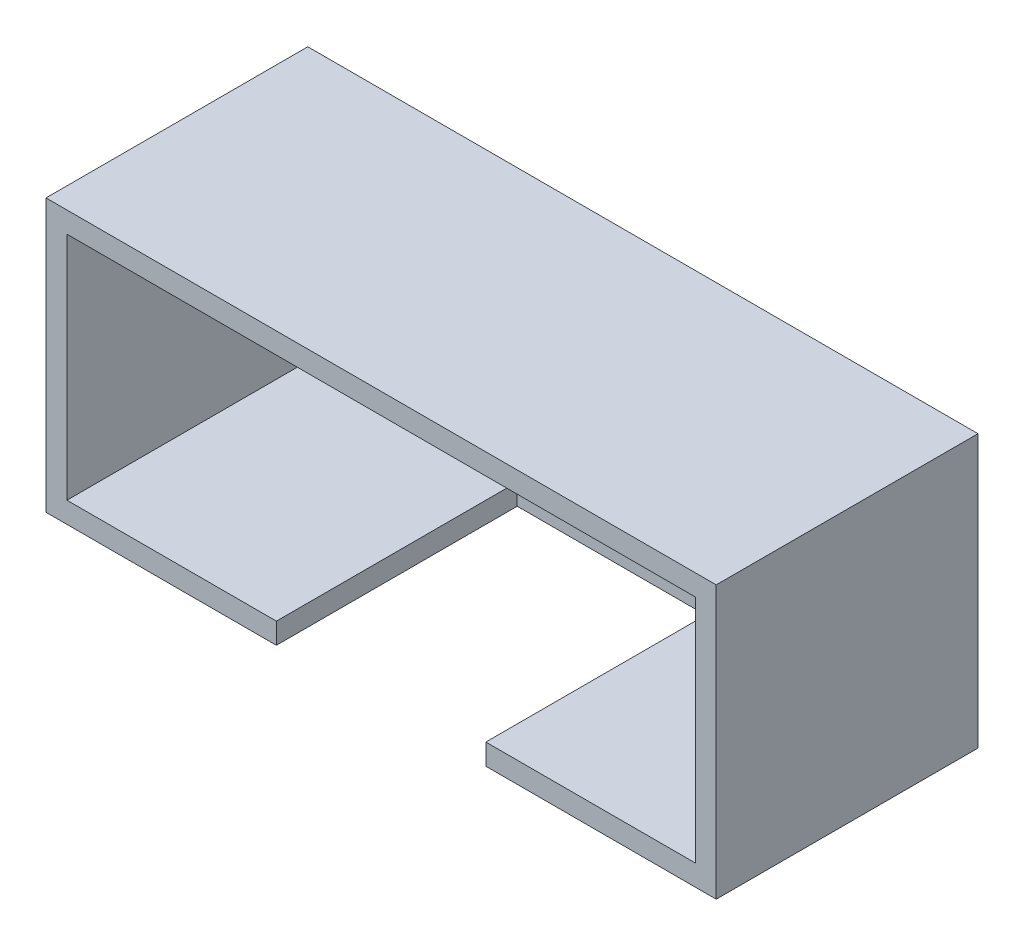
ISO-10303-21;
HEADER;
FILE_DESCRIPTION(('STEP AP214'),'2;1');
FILE_NAME('part.step','',(''),(''),'','','');
FILE_SCHEMA(('AUTOMOTIVE_DESIGN { 1 0 10303 214 1 1 1 1 }'));
ENDSEC;
DATA;
#1=APPLICATION_CONTEXT('core data for automotive mechanical design processes');
#2=APPLICATION_PROTOCOL_DEFINITION('international standard','automotive_design',2000,#1);
#3=PRODUCT_CONTEXT('',#1,'mechanical');
#4=PRODUCT('Part','Part','',(#3));
#5=PRODUCT_RELATED_PRODUCT_CATEGORY('part','',(#4));
#6=PRODUCT_DEFINITION_FORMATION('','',#4);
#7=PRODUCT_DEFINITION_CONTEXT('part definition',#1,'design');
#8=PRODUCT_DEFINITION('design','',#6,#7);
#9=PRODUCT_DEFINITION_SHAPE('','',#8);
#10=(LENGTH_UNIT() NAMED_UNIT(*) SI_UNIT(.MILLI.,.METRE.));
#11=(NAMED_UNIT(*) PLANE_ANGLE_UNIT() SI_UNIT($,.RADIAN.));
#12=(NAMED_UNIT(*) SI_UNIT($,.STERADIAN.) SOLID_ANGLE_UNIT());
#13=UNCERTAINTY_MEASURE_WITH_UNIT(LENGTH_MEASURE(1.E-05),#10,'distance_accuracy_value','');
#14=(GEOMETRIC_REPRESENTATION_CONTEXT(3) GLOBAL_UNCERTAINTY_ASSIGNED_CONTEXT((#13)) GLOBAL_UNIT_ASSIGNED_CONTEXT((#10,
#11,#12)) REPRESENTATION_CONTEXT('',''));
#15=CARTESIAN_POINT('',(0.,0.,0.));
#16=DIRECTION('',(0.,0.,1.));
#17=DIRECTION('',(1.,0.,0.));
#18=AXIS2_PLACEMENT_3D('',#15,#16,#17);
#19=CARTESIAN_POINT('',(-2.,-2.60000000000001,0.4));
#20=DIRECTION('',(-1.,0.,0.));
#21=DIRECTION('',(0.,-1.,0.));
#22=AXIS2_PLACEMENT_3D('',#19,#20,#21);
#23=PLANE('',#22);
#24=DIRECTION('',(0.,-1.,0.));
#25=VECTOR('',#24,1.);
#26=CARTESIAN_POINT('',(-2.,-2.60000000000001,5.));
#27=LINE('',#26,#25);
#28=CARTESIAN_POINT('',(-2.,-2.60000000000001,5.));
#29=VERTEX_POINT('',#28);
#30=CARTESIAN_POINT('',(-2.,-2.20000000000002,5.));
#31=VERTEX_POINT('',#30);
#32=EDGE_CURVE('E138',#29,#31,#27,.F.);
#33=ORIENTED_EDGE('',*,*,#32,.F.);
#34=DIRECTION('',(0.,0.,1.));
#35=VECTOR('',#34,1.);
#36=CARTESIAN_POINT('',(-2.,-2.60000000000001,0.));
#37=LINE('',#36,#35);
#38=CARTESIAN_POINT('',(-2.,-2.60000000000001,0.4));
#39=VERTEX_POINT('',#38);
#40=EDGE_CURVE('E114',#39,#29,#37,.T.);
#41=ORIENTED_EDGE('',*,*,#40,.F.);
#42=DIRECTION('',(0.,1.,0.));
#43=VECTOR('',#42,1.);
#44=CARTESIAN_POINT('',(-2.,0.,0.4));
#45=LINE('',#44,#43);
#46=CARTESIAN_POINT('',(-2.,-2.20000000000002,0.4));
#47=VERTEX_POINT('',#46);
#48=EDGE_CURVE('E109',#47,#39,#45,.F.);
#49=ORIENTED_EDGE('',*,*,#48,.F.);
#50=DIRECTION('',(0.,0.,1.));
#51=VECTOR('',#50,1.);
#52=CARTESIAN_POINT('',(-2.,-2.20000000000002,0.));
#53=LINE('',#52,#51);
#54=EDGE_CURVE('E111',#31,#47,#53,.F.);
#55=ORIENTED_EDGE('',*,*,#54,.F.);
#56=EDGE_LOOP('',(#33,#41,#49,#55));
#57=FACE_BOUND('',#56,.T.);
#58=ADVANCED_FACE('F17',(#57),#23,.F.);
#59=CARTESIAN_POINT('',(2.,-2.60000000000001,5.));
#60=DIRECTION('',(1.,0.,0.));
#61=DIRECTION('',(0.,1.,0.));
#62=AXIS2_PLACEMENT_3D('',#59,#60,#61);
#63=PLANE('',#62);
#64=DIRECTION('',(0.,1.,0.));
#65=VECTOR('',#64,1.);
#66=CARTESIAN_POINT('',(2.,0.,0.4));
#67=LINE('',#66,#65);
#68=CARTESIAN_POINT('',(2.,-2.60000000000001,0.4));
#69=VERTEX_POINT('',#68);
#70=CARTESIAN_POINT('',(2.,-2.20000000000002,0.4));
#71=VERTEX_POINT('',#70);
#72=EDGE_CURVE('E117',#69,#71,#67,.T.);
#73=ORIENTED_EDGE('',*,*,#72,.F.);
#74=DIRECTION('',(0.,0.,1.));
#75=VECTOR('',#74,1.);
#76=CARTESIAN_POINT('',(2.,-2.60000000000001,0.));
#77=LINE('',#76,#75);
#78=CARTESIAN_POINT('',(2.,-2.60000000000001,5.));
#79=VERTEX_POINT('',#78);
#80=EDGE_CURVE('E265',#79,#69,#77,.F.);
#81=ORIENTED_EDGE('',*,*,#80,.F.);
#82=DIRECTION('',(0.,1.,0.));
#83=VECTOR('',#82,1.);
#84=CARTESIAN_POINT('',(2.,-2.60000000000001,5.));
#85=LINE('',#84,#83);
#86=CARTESIAN_POINT('',(2.,-2.20000000000002,5.));
#87=VERTEX_POINT('',#86);
#88=EDGE_CURVE('E118',#87,#79,#85,.F.);
#89=ORIENTED_EDGE('',*,*,#88,.F.);
#90=DIRECTION('',(0.,0.,1.));
#91=VECTOR('',#90,1.);
#92=CARTESIAN_POINT('',(2.,-2.20000000000002,0.));
#93=LINE('',#92,#91);
#94=EDGE_CURVE('E275',#71,#87,#93,.T.);
#95=ORIENTED_EDGE('',*,*,#94,.F.);
#96=EDGE_LOOP('',(#73,#81,#89,#95));
#97=FACE_BOUND('',#96,.T.);
#98=ADVANCED_FACE('F310',(#97),#63,.F.);
#99=CARTESIAN_POINT('',(0.,0.,0.4));
#100=DIRECTION('',(0.,0.,1.));
#101=DIRECTION('',(1.,0.,0.));
#102=AXIS2_PLACEMENT_3D('',#99,#100,#101);
#103=PLANE('',#102);
#104=CARTESIAN_POINT('',(-2.53,0.749999999999982,0.4));
#105=DIRECTION('',(0.,0.,1.));
#106=DIRECTION('',(1.,0.,0.));
#107=AXIS2_PLACEMENT_3D('',#104,#105,#106);
#108=CIRCLE('',#107,0.399999999999991);
#109=CARTESIAN_POINT('',(-2.13000000000001,0.749999999999982,0.4));
#110=VERTEX_POINT('',#109);
#111=EDGE_CURVE('E191',#110,#110,#108,.F.);
#112=ORIENTED_EDGE('',*,*,#111,.T.);
#113=EDGE_LOOP('',(#112));
#114=FACE_BOUND('',#113,.T.);
#115=CARTESIAN_POINT('',(-2.53,-0.520000000000007,0.4));
#116=DIRECTION('',(0.,0.,1.));
#117=DIRECTION('',(1.,0.,0.));
#118=AXIS2_PLACEMENT_3D('',#115,#116,#117);
#119=CIRCLE('',#118,0.399999999999991);
#120=CARTESIAN_POINT('',(-2.13000000000001,-0.520000000000007,0.4));
#121=VERTEX_POINT('',#120);
#122=EDGE_CURVE('E189',#121,#121,#119,.F.);
#123=ORIENTED_EDGE('',*,*,#122,.T.);
#124=EDGE_LOOP('',(#123));
#125=FACE_BOUND('',#124,.T.);
#126=CARTESIAN_POINT('',(2.55,0.749999999999981,0.4));
#127=DIRECTION('',(0.,0.,1.));
#128=DIRECTION('',(1.,0.,0.));
#129=AXIS2_PLACEMENT_3D('',#126,#127,#128);
#130=CIRCLE('',#129,0.399999999999991);
#131=CARTESIAN_POINT('',(2.94999999999999,0.749999999999981,0.4));
#132=VERTEX_POINT('',#131);
#133=EDGE_CURVE('E177',#132,#132,#130,.F.);
#134=ORIENTED_EDGE('',*,*,#133,.T.);
#135=EDGE_LOOP('',(#134));
#136=FACE_BOUND('',#135,.T.);
#137=CARTESIAN_POINT('',(2.55,-0.520000000000008,0.4));
#138=DIRECTION('',(0.,0.,1.));
#139=DIRECTION('',(1.,0.,0.));
#140=AXIS2_PLACEMENT_3D('',#137,#138,#139);
#141=CIRCLE('',#140,0.399999999999991);
#142=CARTESIAN_POINT('',(2.94999999999999,-0.520000000000008,0.4));
#143=VERTEX_POINT('',#142);
#144=EDGE_CURVE('E128',#143,#143,#141,.F.);
#145=ORIENTED_EDGE('',*,*,#144,.T.);
#146=EDGE_LOOP('',(#145));
#147=FACE_BOUND('',#146,.T.);
#148=CARTESIAN_POINT('',(1.28,-0.520000000000007,0.4));
#149=DIRECTION('',(0.,0.,1.));
#150=DIRECTION('',(1.,0.,0.));
#151=AXIS2_PLACEMENT_3D('',#148,#149,#150);
#152=CIRCLE('',#151,0.399999999999991);
#153=CARTESIAN_POINT('',(1.67999999999999,-0.520000000000007,0.4));
#154=VERTEX_POINT('',#153);
#155=EDGE_CURVE('E20',#154,#154,#152,.F.);
#156=ORIENTED_EDGE('',*,*,#155,.T.);
#157=EDGE_LOOP('',(#156));
#158=FACE_BOUND('',#157,.T.);
#159=CARTESIAN_POINT('',(-1.26,0.749999999999982,0.4));
#160=DIRECTION('',(0.,0.,1.));
#161=DIRECTION('',(1.,0.,0.));
#162=AXIS2_PLACEMENT_3D('',#159,#160,#161);
#163=CIRCLE('',#162,0.399999999999991);
#164=CARTESIAN_POINT('',(-0.860000000000009,0.749999999999982,0.4));
#165=VERTEX_POINT('',#164);
#166=EDGE_CURVE('E186',#165,#165,#163,.F.);
#167=ORIENTED_EDGE('',*,*,#166,.T.);
#168=EDGE_LOOP('',(#167));
#169=FACE_BOUND('',#168,.T.);
#170=CARTESIAN_POINT('',(-1.26,-0.520000000000007,0.4));
#171=DIRECTION('',(0.,0.,1.));
#172=DIRECTION('',(1.,0.,0.));
#173=AXIS2_PLACEMENT_3D('',#170,#171,#172);
#174=CIRCLE('',#173,0.399999999999991);
#175=CARTESIAN_POINT('',(-0.860000000000009,-0.520000000000007,0.4));
#176=VERTEX_POINT('',#175);
#177=EDGE_CURVE('E183',#176,#176,#174,.F.);
#178=ORIENTED_EDGE('',*,*,#177,.T.);
#179=EDGE_LOOP('',(#178));
#180=FACE_BOUND('',#179,.T.);
#181=CARTESIAN_POINT('',(0.0100000000000004,-0.520000000000007,0.4));
#182=DIRECTION('',(0.,0.,1.));
#183=DIRECTION('',(1.,0.,0.));
#184=AXIS2_PLACEMENT_3D('',#181,#182,#183);
#185=CIRCLE('',#184,0.399999999999991);
#186=CARTESIAN_POINT('',(0.409999999999991,-0.520000000000007,0.4));
#187=VERTEX_POINT('',#186);
#188=EDGE_CURVE('E180',#187,#187,#185,.F.);
#189=ORIENTED_EDGE('',*,*,#188,.T.);
#190=EDGE_LOOP('',(#189));
#191=FACE_BOUND('',#190,.T.);
#192=CARTESIAN_POINT('',(1.28,0.749999999999982,0.4));
#193=DIRECTION('',(0.,0.,1.));
#194=DIRECTION('',(1.,0.,0.));
#195=AXIS2_PLACEMENT_3D('',#192,#193,#194);
#196=CIRCLE('',#195,0.399999999999991);
#197=CARTESIAN_POINT('',(1.67999999999999,0.749999999999982,0.4));
#198=VERTEX_POINT('',#197);
#199=EDGE_CURVE('E174',#198,#198,#196,.F.);
#200=ORIENTED_EDGE('',*,*,#199,.T.);
#201=EDGE_LOOP('',(#200));
#202=FACE_BOUND('',#201,.T.);
#203=CARTESIAN_POINT('',(0.0100000000000007,0.749999999999982,0.4));
#204=DIRECTION('',(0.,0.,1.));
#205=DIRECTION('',(1.,0.,0.));
#206=AXIS2_PLACEMENT_3D('',#203,#204,#205);
#207=CIRCLE('',#206,0.399999999999991);
#208=CARTESIAN_POINT('',(0.409999999999992,0.749999999999982,0.4));
#209=VERTEX_POINT('',#208);
#210=EDGE_CURVE('E131',#209,#209,#207,.F.);
#211=ORIENTED_EDGE('',*,*,#210,.T.);
#212=EDGE_LOOP('',(#211));
#213=FACE_BOUND('',#212,.T.);
#214=DIRECTION('',(1.,0.,0.));
#215=VECTOR('',#214,1.);
#216=CARTESIAN_POINT('',(-6.4,-2.60000000000001,0.4));
#217=LINE('',#216,#215);
#218=EDGE_CURVE('E263',#69,#39,#217,.F.);
#219=ORIENTED_EDGE('',*,*,#218,.F.);
#220=ORIENTED_EDGE('',*,*,#72,.T.);
#221=DIRECTION('',(-1.,0.,0.));
#222=VECTOR('',#221,1.);
#223=CARTESIAN_POINT('',(6.,-2.20000000000002,0.4));
#224=LINE('',#223,#222);
#225=CARTESIAN_POINT('',(6.,-2.20000000000002,0.4));
#226=VERTEX_POINT('',#225);
#227=EDGE_CURVE('E269',#226,#71,#224,.T.);
#228=ORIENTED_EDGE('',*,*,#227,.F.);
#229=DIRECTION('',(0.,-1.,0.));
#230=VECTOR('',#229,1.);
#231=CARTESIAN_POINT('',(6.,2.19999999999999,0.4));
#232=LINE('',#231,#230);
#233=CARTESIAN_POINT('',(6.,2.19999999999999,0.4));
#234=VERTEX_POINT('',#233);
#235=EDGE_CURVE('E281',#234,#226,#232,.T.);
#236=ORIENTED_EDGE('',*,*,#235,.F.);
#237=DIRECTION('',(1.,0.,0.));
#238=VECTOR('',#237,1.);
#239=CARTESIAN_POINT('',(-6.,2.2,0.4));
#240=LINE('',#239,#238);
#241=CARTESIAN_POINT('',(-6.,2.2,0.4));
#242=VERTEX_POINT('',#241);
#243=EDGE_CURVE('E286',#242,#234,#240,.T.);
#244=ORIENTED_EDGE('',*,*,#243,.F.);
#245=DIRECTION('',(0.,1.,0.));
#246=VECTOR('',#245,1.);
#247=CARTESIAN_POINT('',(-6.,-2.20000000000002,0.4));
#248=LINE('',#247,#246);
#249=CARTESIAN_POINT('',(-6.,-2.20000000000002,0.4));
#250=VERTEX_POINT('',#249);
#251=EDGE_CURVE('E103',#250,#242,#248,.T.);
#252=ORIENTED_EDGE('',*,*,#251,.F.);
#253=DIRECTION('',(-1.,0.,0.));
#254=VECTOR('',#253,1.);
#255=CARTESIAN_POINT('',(6.,-2.20000000000002,0.4));
#256=LINE('',#255,#254);
#257=EDGE_CURVE('E120',#47,#250,#256,.T.);
#258=ORIENTED_EDGE('',*,*,#257,.F.);
#259=ORIENTED_EDGE('',*,*,#48,.T.);
#260=EDGE_LOOP('',(#219,#220,#228,#236,#244,#252,#258,#259));
#261=FACE_BOUND('',#260,.T.);
#262=ADVANCED_FACE('F121',(#114,#125,#136,#147,#158,#169,#180,#191,#202,#213,#261),#103,.T.);
#263=CARTESIAN_POINT('',(1.28,-0.520000000000007,0.));
#264=DIRECTION('',(0.,0.,1.));
#265=DIRECTION('',(1.,0.,0.));
#266=AXIS2_PLACEMENT_3D('',#263,#264,#265);
#267=CYLINDRICAL_SURFACE('',#266,0.399999999999991);
#268=ORIENTED_EDGE('',*,*,#155,.F.);
#269=EDGE_LOOP('',(#268));
#270=FACE_BOUND('',#269,.T.);
#271=CARTESIAN_POINT('',(1.28,-0.520000000000007,0.));
#272=DIRECTION('',(0.,0.,1.));
#273=DIRECTION('',(1.,0.,0.));
#274=AXIS2_PLACEMENT_3D('',#271,#272,#273);
#275=CIRCLE('',#274,0.399999999999991);
#276=CARTESIAN_POINT('',(1.67999999999999,-0.520000000000007,0.));
#277=VERTEX_POINT('',#276);
#278=EDGE_CURVE('E168',#277,#277,#275,.F.);
#279=ORIENTED_EDGE('',*,*,#278,.T.);
#280=EDGE_LOOP('',(#279));
#281=FACE_BOUND('',#280,.T.);
#282=ADVANCED_FACE('F200',(#270,#281),#267,.F.);
#283=CARTESIAN_POINT('',(-2.53,0.749999999999982,0.));
#284=DIRECTION('',(0.,0.,1.));
#285=DIRECTION('',(1.,0.,0.));
#286=AXIS2_PLACEMENT_3D('',#283,#284,#285);
#287=CYLINDRICAL_SURFACE('',#286,0.399999999999991);
#288=ORIENTED_EDGE('',*,*,#111,.F.);
#289=EDGE_LOOP('',(#288));
#290=FACE_BOUND('',#289,.T.);
#291=CARTESIAN_POINT('',(-2.53,0.749999999999982,0.));
#292=DIRECTION('',(0.,0.,1.));
#293=DIRECTION('',(1.,0.,0.));
#294=AXIS2_PLACEMENT_3D('',#291,#292,#293);
#295=CIRCLE('',#294,0.399999999999991);
#296=CARTESIAN_POINT('',(-2.13000000000001,0.749999999999982,0.));
#297=VERTEX_POINT('',#296);
#298=EDGE_CURVE('E165',#297,#297,#295,.F.);
#299=ORIENTED_EDGE('',*,*,#298,.T.);
#300=EDGE_LOOP('',(#299));
#301=FACE_BOUND('',#300,.T.);
#302=ADVANCED_FACE('F203',(#290,#301),#287,.F.);
#303=CARTESIAN_POINT('',(-2.53,-0.520000000000007,0.));
#304=DIRECTION('',(0.,0.,1.));
#305=DIRECTION('',(1.,0.,0.));
#306=AXIS2_PLACEMENT_3D('',#303,#304,#305);
#307=CYLINDRICAL_SURFACE('',#306,0.399999999999991);
#308=ORIENTED_EDGE('',*,*,#122,.F.);
#309=EDGE_LOOP('',(#308));
#310=FACE_BOUND('',#309,.T.);
#311=CARTESIAN_POINT('',(-2.53,-0.520000000000007,0.));
#312=DIRECTION('',(0.,0.,1.));
#313=DIRECTION('',(1.,0.,0.));
#314=AXIS2_PLACEMENT_3D('',#311,#312,#313);
#315=CIRCLE('',#314,0.399999999999991);
#316=CARTESIAN_POINT('',(-2.13000000000001,-0.520000000000007,0.));
#317=VERTEX_POINT('',#316);
#318=EDGE_CURVE('E162',#317,#317,#315,.F.);
#319=ORIENTED_EDGE('',*,*,#318,.T.);
#320=EDGE_LOOP('',(#319));
#321=FACE_BOUND('',#320,.T.);
#322=ADVANCED_FACE('F464',(#310,#321),#307,.F.);
#323=CARTESIAN_POINT('',(-1.26,0.749999999999982,0.));
#324=DIRECTION('',(0.,0.,1.));
#325=DIRECTION('',(1.,0.,0.));
#326=AXIS2_PLACEMENT_3D('',#323,#324,#325);
#327=CYLINDRICAL_SURFACE('',#326,0.399999999999991);
#328=ORIENTED_EDGE('',*,*,#166,.F.);
#329=EDGE_LOOP('',(#328));
#330=FACE_BOUND('',#329,.T.);
#331=CARTESIAN_POINT('',(-1.26,0.749999999999982,0.));
#332=DIRECTION('',(0.,0.,1.));
#333=DIRECTION('',(1.,0.,0.));
#334=AXIS2_PLACEMENT_3D('',#331,#332,#333);
#335=CIRCLE('',#334,0.399999999999991);
#336=CARTESIAN_POINT('',(-0.860000000000009,0.749999999999982,0.));
#337=VERTEX_POINT('',#336);
#338=EDGE_CURVE('E159',#337,#337,#335,.F.);
#339=ORIENTED_EDGE('',*,*,#338,.T.);
#340=EDGE_LOOP('',(#339));
#341=FACE_BOUND('',#340,.T.);
#342=ADVANCED_FACE('F454',(#330,#341),#327,.F.);
#343=CARTESIAN_POINT('',(-1.26,-0.520000000000007,0.));
#344=DIRECTION('',(0.,0.,1.));
#345=DIRECTION('',(1.,0.,0.));
#346=AXIS2_PLACEMENT_3D('',#343,#344,#345);
#347=CYLINDRICAL_SURFACE('',#346,0.399999999999991);
#348=ORIENTED_EDGE('',*,*,#177,.F.);
#349=EDGE_LOOP('',(#348));
#350=FACE_BOUND('',#349,.T.);
#351=CARTESIAN_POINT('',(-1.26,-0.520000000000007,0.));
#352=DIRECTION('',(0.,0.,1.));
#353=DIRECTION('',(1.,0.,0.));
#354=AXIS2_PLACEMENT_3D('',#351,#352,#353);
#355=CIRCLE('',#354,0.399999999999991);
#356=CARTESIAN_POINT('',(-0.860000000000009,-0.520000000000007,0.));
#357=VERTEX_POINT('',#356);
#358=EDGE_CURVE('E156',#357,#357,#355,.F.);
#359=ORIENTED_EDGE('',*,*,#358,.T.);
#360=EDGE_LOOP('',(#359));
#361=FACE_BOUND('',#360,.T.);
#362=ADVANCED_FACE('F444',(#350,#361),#347,.F.);
#363=CARTESIAN_POINT('',(0.0100000000000004,-0.520000000000007,0.));
#364=DIRECTION('',(0.,0.,1.));
#365=DIRECTION('',(1.,0.,0.));
#366=AXIS2_PLACEMENT_3D('',#363,#364,#365);
#367=CYLINDRICAL_SURFACE('',#366,0.399999999999991);
#368=ORIENTED_EDGE('',*,*,#188,.F.);
#369=EDGE_LOOP('',(#368));
#370=FACE_BOUND('',#369,.T.);
#371=CARTESIAN_POINT('',(0.0100000000000004,-0.520000000000007,0.));
#372=DIRECTION('',(0.,0.,1.));
#373=DIRECTION('',(1.,0.,0.));
#374=AXIS2_PLACEMENT_3D('',#371,#372,#373);
#375=CIRCLE('',#374,0.399999999999991);
#376=CARTESIAN_POINT('',(0.409999999999991,-0.520000000000007,0.));
#377=VERTEX_POINT('',#376);
#378=EDGE_CURVE('E153',#377,#377,#375,.F.);
#379=ORIENTED_EDGE('',*,*,#378,.T.);
#380=EDGE_LOOP('',(#379));
#381=FACE_BOUND('',#380,.T.);
#382=ADVANCED_FACE('F434',(#370,#381),#367,.F.);
#383=CARTESIAN_POINT('',(2.55,0.749999999999981,0.));
#384=DIRECTION('',(0.,0.,1.));
#385=DIRECTION('',(1.,0.,0.));
#386=AXIS2_PLACEMENT_3D('',#383,#384,#385);
#387=CYLINDRICAL_SURFACE('',#386,0.399999999999991);
#388=ORIENTED_EDGE('',*,*,#133,.F.);
#389=EDGE_LOOP('',(#388));
#390=FACE_BOUND('',#389,.T.);
#391=CARTESIAN_POINT('',(2.55,0.749999999999981,0.));
#392=DIRECTION('',(0.,0.,1.));
#393=DIRECTION('',(1.,0.,0.));
#394=AXIS2_PLACEMENT_3D('',#391,#392,#393);
#395=CIRCLE('',#394,0.399999999999991);
#396=CARTESIAN_POINT('',(2.94999999999999,0.749999999999981,0.));
#397=VERTEX_POINT('',#396);
#398=EDGE_CURVE('E150',#397,#397,#395,.F.);
#399=ORIENTED_EDGE('',*,*,#398,.T.);
#400=EDGE_LOOP('',(#399));
#401=FACE_BOUND('',#400,.T.);
#402=ADVANCED_FACE('F424',(#390,#401),#387,.F.);
#403=CARTESIAN_POINT('',(1.28,0.749999999999982,0.));
#404=DIRECTION('',(0.,0.,1.));
#405=DIRECTION('',(1.,0.,0.));
#406=AXIS2_PLACEMENT_3D('',#403,#404,#405);
#407=CYLINDRICAL_SURFACE('',#406,0.399999999999991);
#408=ORIENTED_EDGE('',*,*,#199,.F.);
#409=EDGE_LOOP('',(#408));
#410=FACE_BOUND('',#409,.T.);
#411=CARTESIAN_POINT('',(1.28,0.749999999999982,0.));
#412=DIRECTION('',(0.,0.,1.));
#413=DIRECTION('',(1.,0.,0.));
#414=AXIS2_PLACEMENT_3D('',#411,#412,#413);
#415=CIRCLE('',#414,0.399999999999991);
#416=CARTESIAN_POINT('',(1.67999999999999,0.749999999999982,0.));
#417=VERTEX_POINT('',#416);
#418=EDGE_CURVE('E147',#417,#417,#415,.F.);
#419=ORIENTED_EDGE('',*,*,#418,.T.);
#420=EDGE_LOOP('',(#419));
#421=FACE_BOUND('',#420,.T.);
#422=ADVANCED_FACE('F414',(#410,#421),#407,.F.);
#423=CARTESIAN_POINT('',(0.0100000000000007,0.749999999999982,0.));
#424=DIRECTION('',(0.,0.,1.));
#425=DIRECTION('',(1.,0.,0.));
#426=AXIS2_PLACEMENT_3D('',#423,#424,#425);
#427=CYLINDRICAL_SURFACE('',#426,0.399999999999991);
#428=ORIENTED_EDGE('',*,*,#210,.F.);
#429=EDGE_LOOP('',(#428));
#430=FACE_BOUND('',#429,.T.);
#431=CARTESIAN_POINT('',(0.0100000000000007,0.749999999999982,0.));
#432=DIRECTION('',(0.,0.,1.));
#433=DIRECTION('',(1.,0.,0.));
#434=AXIS2_PLACEMENT_3D('',#431,#432,#433);
#435=CIRCLE('',#434,0.399999999999991);
#436=CARTESIAN_POINT('',(0.409999999999992,0.749999999999982,0.));
#437=VERTEX_POINT('',#436);
#438=EDGE_CURVE('E144',#437,#437,#435,.F.);
#439=ORIENTED_EDGE('',*,*,#438,.T.);
#440=EDGE_LOOP('',(#439));
#441=FACE_BOUND('',#440,.T.);
#442=ADVANCED_FACE('F404',(#430,#441),#427,.F.);
#443=CARTESIAN_POINT('',(2.55,-0.520000000000008,0.));
#444=DIRECTION('',(0.,0.,1.));
#445=DIRECTION('',(1.,0.,0.));
#446=AXIS2_PLACEMENT_3D('',#443,#444,#445);
#447=CYLINDRICAL_SURFACE('',#446,0.399999999999991);
#448=ORIENTED_EDGE('',*,*,#144,.F.);
#449=EDGE_LOOP('',(#448));
#450=FACE_BOUND('',#449,.T.);
#451=CARTESIAN_POINT('',(2.55,-0.520000000000008,0.));
#452=DIRECTION('',(0.,0.,1.));
#453=DIRECTION('',(1.,0.,0.));
#454=AXIS2_PLACEMENT_3D('',#451,#452,#453);
#455=CIRCLE('',#454,0.399999999999991);
#456=CARTESIAN_POINT('',(2.94999999999999,-0.520000000000008,0.));
#457=VERTEX_POINT('',#456);
#458=EDGE_CURVE('E140',#457,#457,#455,.F.);
#459=ORIENTED_EDGE('',*,*,#458,.T.);
#460=EDGE_LOOP('',(#459));
#461=FACE_BOUND('',#460,.T.);
#462=ADVANCED_FACE('F395',(#450,#461),#447,.F.);
#463=CARTESIAN_POINT('',(6.,-2.20000000000002,0.));
#464=DIRECTION('',(0.,1.,0.));
#465=DIRECTION('',(-1.,0.,0.));
#466=AXIS2_PLACEMENT_3D('',#463,#464,#465);
#467=PLANE('',#466);
#468=DIRECTION('',(0.,0.,1.));
#469=VECTOR('',#468,1.);
#470=CARTESIAN_POINT('',(-6.,-2.20000000000002,0.));
#471=LINE('',#470,#469);
#472=CARTESIAN_POINT('',(-6.,-2.20000000000002,5.));
#473=VERTEX_POINT('',#472);
#474=EDGE_CURVE('E289',#473,#250,#471,.F.);
#475=ORIENTED_EDGE('',*,*,#474,.F.);
#476=DIRECTION('',(1.,0.,0.));
#477=VECTOR('',#476,1.);
#478=CARTESIAN_POINT('',(0.,-2.20000000000002,5.));
#479=LINE('',#478,#477);
#480=EDGE_CURVE('E127',#31,#473,#479,.F.);
#481=ORIENTED_EDGE('',*,*,#480,.F.);
#482=ORIENTED_EDGE('',*,*,#54,.T.);
#483=ORIENTED_EDGE('',*,*,#257,.T.);
#484=EDGE_LOOP('',(#475,#481,#482,#483));
#485=FACE_BOUND('',#484,.T.);
#486=ADVANCED_FACE('F125',(#485),#467,.T.);
#487=CARTESIAN_POINT('',(-6.,-2.20000000000002,0.));
#488=DIRECTION('',(1.,0.,0.));
#489=DIRECTION('',(0.,1.,0.));
#490=AXIS2_PLACEMENT_3D('',#487,#488,#489);
#491=PLANE('',#490);
#492=DIRECTION('',(0.,1.,0.));
#493=VECTOR('',#492,1.);
#494=CARTESIAN_POINT('',(-6.,0.,5.));
#495=LINE('',#494,#493);
#496=CARTESIAN_POINT('',(-6.,2.2,5.));
#497=VERTEX_POINT('',#496);
#498=EDGE_CURVE('E255',#473,#497,#495,.T.);
#499=ORIENTED_EDGE('',*,*,#498,.F.);
#500=ORIENTED_EDGE('',*,*,#474,.T.);
#501=ORIENTED_EDGE('',*,*,#251,.T.);
#502=DIRECTION('',(0.,0.,1.));
#503=VECTOR('',#502,1.);
#504=CARTESIAN_POINT('',(-6.,2.2,0.));
#505=LINE('',#504,#503);
#506=EDGE_CURVE('E283',#497,#242,#505,.F.);
#507=ORIENTED_EDGE('',*,*,#506,.F.);
#508=EDGE_LOOP('',(#499,#500,#501,#507));
#509=FACE_BOUND('',#508,.T.);
#510=ADVANCED_FACE('F292',(#509),#491,.T.);
#511=CARTESIAN_POINT('',(-6.,2.2,0.));
#512=DIRECTION('',(0.,-1.,0.));
#513=DIRECTION('',(1.,0.,0.));
#514=AXIS2_PLACEMENT_3D('',#511,#512,#513);
#515=PLANE('',#514);
#516=DIRECTION('',(1.,0.,0.));
#517=VECTOR('',#516,1.);
#518=CARTESIAN_POINT('',(0.,2.2,5.));
#519=LINE('',#518,#517);
#520=CARTESIAN_POINT('',(6.,2.2,5.));
#521=VERTEX_POINT('',#520);
#522=EDGE_CURVE('E252',#497,#521,#519,.T.);
#523=ORIENTED_EDGE('',*,*,#522,.F.);
#524=ORIENTED_EDGE('',*,*,#506,.T.);
#525=ORIENTED_EDGE('',*,*,#243,.T.);
#526=DIRECTION('',(0.,0.,1.));
#527=VECTOR('',#526,1.);
#528=CARTESIAN_POINT('',(6.,2.19999999999999,0.));
#529=LINE('',#528,#527);
#530=EDGE_CURVE('E278',#521,#234,#529,.F.);
#531=ORIENTED_EDGE('',*,*,#530,.F.);
#532=EDGE_LOOP('',(#523,#524,#525,#531));
#533=FACE_BOUND('',#532,.T.);
#534=ADVANCED_FACE('F295',(#533),#515,.T.);
#535=CARTESIAN_POINT('',(6.,2.19999999999999,0.));
#536=DIRECTION('',(-1.,0.,0.));
#537=DIRECTION('',(0.,-1.,0.));
#538=AXIS2_PLACEMENT_3D('',#535,#536,#537);
#539=PLANE('',#538);
#540=DIRECTION('',(0.,1.,0.));
#541=VECTOR('',#540,1.);
#542=CARTESIAN_POINT('',(6.,0.,5.));
#543=LINE('',#542,#541);
#544=CARTESIAN_POINT('',(6.,-2.20000000000002,5.));
#545=VERTEX_POINT('',#544);
#546=EDGE_CURVE('E249',#521,#545,#543,.F.);
#547=ORIENTED_EDGE('',*,*,#546,.F.);
#548=ORIENTED_EDGE('',*,*,#530,.T.);
#549=ORIENTED_EDGE('',*,*,#235,.T.);
#550=DIRECTION('',(0.,0.,1.));
#551=VECTOR('',#550,1.);
#552=CARTESIAN_POINT('',(6.,-2.20000000000002,0.));
#553=LINE('',#552,#551);
#554=EDGE_CURVE('E272',#545,#226,#553,.F.);
#555=ORIENTED_EDGE('',*,*,#554,.F.);
#556=EDGE_LOOP('',(#547,#548,#549,#555));
#557=FACE_BOUND('',#556,.T.);
#558=ADVANCED_FACE('F309',(#557),#539,.T.);
#559=CARTESIAN_POINT('',(6.,-2.20000000000002,0.));
#560=DIRECTION('',(0.,1.,0.));
#561=DIRECTION('',(-1.,0.,0.));
#562=AXIS2_PLACEMENT_3D('',#559,#560,#561);
#563=PLANE('',#562);
#564=ORIENTED_EDGE('',*,*,#554,.T.);
#565=ORIENTED_EDGE('',*,*,#227,.T.);
#566=ORIENTED_EDGE('',*,*,#94,.T.);
#567=DIRECTION('',(1.,0.,0.));
#568=VECTOR('',#567,1.);
#569=CARTESIAN_POINT('',(0.,-2.20000000000002,5.));
#570=LINE('',#569,#568);
#571=EDGE_CURVE('E246',#545,#87,#570,.F.);
#572=ORIENTED_EDGE('',*,*,#571,.F.);
#573=EDGE_LOOP('',(#564,#565,#566,#572));
#574=FACE_BOUND('',#573,.T.);
#575=ADVANCED_FACE('F306',(#574),#563,.T.);
#576=CARTESIAN_POINT('',(-6.4,-2.60000000000001,0.));
#577=DIRECTION('',(0.,-1.,0.));
#578=DIRECTION('',(1.,0.,0.));
#579=AXIS2_PLACEMENT_3D('',#576,#577,#578);
#580=PLANE('',#579);
#581=ORIENTED_EDGE('',*,*,#80,.T.);
#582=ORIENTED_EDGE('',*,*,#218,.T.);
#583=ORIENTED_EDGE('',*,*,#40,.T.);
#584=DIRECTION('',(1.,0.,0.));
#585=VECTOR('',#584,1.);
#586=CARTESIAN_POINT('',(0.,-2.60000000000001,5.));
#587=LINE('',#586,#585);
#588=CARTESIAN_POINT('',(-6.4,-2.60000000000001,5.));
#589=VERTEX_POINT('',#588);
#590=EDGE_CURVE('E231',#589,#29,#587,.T.);
#591=ORIENTED_EDGE('',*,*,#590,.F.);
#592=DIRECTION('',(0.,0.,1.));
#593=VECTOR('',#592,1.);
#594=CARTESIAN_POINT('',(-6.4,-2.60000000000001,0.));
#595=LINE('',#594,#593);
#596=CARTESIAN_POINT('',(-6.4,-2.60000000000001,0.));
#597=VERTEX_POINT('',#596);
#598=EDGE_CURVE('E259',#597,#589,#595,.T.);
#599=ORIENTED_EDGE('',*,*,#598,.F.);
#600=DIRECTION('',(1.,0.,0.));
#601=VECTOR('',#600,1.);
#602=CARTESIAN_POINT('',(0.,-2.60000000000001,0.));
#603=LINE('',#602,#601);
#604=CARTESIAN_POINT('',(6.4,-2.60000000000001,0.));
#605=VERTEX_POINT('',#604);
#606=EDGE_CURVE('E170',#597,#605,#603,.T.);
#607=ORIENTED_EDGE('',*,*,#606,.T.);
#608=DIRECTION('',(0.,0.,1.));
#609=VECTOR('',#608,1.);
#610=CARTESIAN_POINT('',(6.4,-2.60000000000001,0.));
#611=LINE('',#610,#609);
#612=CARTESIAN_POINT('',(6.4,-2.60000000000001,5.));
#613=VERTEX_POINT('',#612);
#614=EDGE_CURVE('E225',#613,#605,#611,.F.);
#615=ORIENTED_EDGE('',*,*,#614,.F.);
#616=DIRECTION('',(1.,0.,0.));
#617=VECTOR('',#616,1.);
#618=CARTESIAN_POINT('',(0.,-2.60000000000001,5.));
#619=LINE('',#618,#617);
#620=EDGE_CURVE('E244',#79,#613,#619,.T.);
#621=ORIENTED_EDGE('',*,*,#620,.F.);
#622=EDGE_LOOP('',(#581,#582,#583,#591,#599,#607,#615,#621));
#623=FACE_BOUND('',#622,.T.);
#624=ADVANCED_FACE('F211',(#623),#580,.T.);
#625=CARTESIAN_POINT('',(0.,0.,0.));
#626=DIRECTION('',(0.,0.,1.));
#627=DIRECTION('',(1.,0.,0.));
#628=AXIS2_PLACEMENT_3D('',#625,#626,#627);
#629=PLANE('',#628);
#630=ORIENTED_EDGE('',*,*,#458,.F.);
#631=EDGE_LOOP('',(#630));
#632=FACE_BOUND('',#631,.T.);
#633=ORIENTED_EDGE('',*,*,#438,.F.);
#634=EDGE_LOOP('',(#633));
#635=FACE_BOUND('',#634,.T.);
#636=ORIENTED_EDGE('',*,*,#418,.F.);
#637=EDGE_LOOP('',(#636));
#638=FACE_BOUND('',#637,.T.);
#639=ORIENTED_EDGE('',*,*,#398,.F.);
#640=EDGE_LOOP('',(#639));
#641=FACE_BOUND('',#640,.T.);
#642=ORIENTED_EDGE('',*,*,#378,.F.);
#643=EDGE_LOOP('',(#642));
#644=FACE_BOUND('',#643,.T.);
#645=ORIENTED_EDGE('',*,*,#358,.F.);
#646=EDGE_LOOP('',(#645));
#647=FACE_BOUND('',#646,.T.);
#648=ORIENTED_EDGE('',*,*,#338,.F.);
#649=EDGE_LOOP('',(#648));
#650=FACE_BOUND('',#649,.T.);
#651=ORIENTED_EDGE('',*,*,#318,.F.);
#652=EDGE_LOOP('',(#651));
#653=FACE_BOUND('',#652,.T.);
#654=ORIENTED_EDGE('',*,*,#298,.F.);
#655=EDGE_LOOP('',(#654));
#656=FACE_BOUND('',#655,.T.);
#657=ORIENTED_EDGE('',*,*,#278,.F.);
#658=EDGE_LOOP('',(#657));
#659=FACE_BOUND('',#658,.T.);
#660=DIRECTION('',(-1.,0.,0.));
#661=VECTOR('',#660,1.);
#662=CARTESIAN_POINT('',(6.4,2.59999999999999,0.));
#663=LINE('',#662,#661);
#664=CARTESIAN_POINT('',(6.4,2.59999999999999,0.));
#665=VERTEX_POINT('',#664);
#666=CARTESIAN_POINT('',(-6.4,2.59999999999999,0.));
#667=VERTEX_POINT('',#666);
#668=EDGE_CURVE('E216',#665,#667,#663,.T.);
#669=ORIENTED_EDGE('',*,*,#668,.F.);
#670=DIRECTION('',(0.,1.,0.));
#671=VECTOR('',#670,1.);
#672=CARTESIAN_POINT('',(6.4,-2.60000000000001,0.));
#673=LINE('',#672,#671);
#674=EDGE_CURVE('E218',#605,#665,#673,.T.);
#675=ORIENTED_EDGE('',*,*,#674,.F.);
#676=ORIENTED_EDGE('',*,*,#606,.F.);
#677=DIRECTION('',(0.,-1.,0.));
#678=VECTOR('',#677,1.);
#679=CARTESIAN_POINT('',(-6.4,2.6,0.));
#680=LINE('',#679,#678);
#681=EDGE_CURVE('E143',#667,#597,#680,.T.);
#682=ORIENTED_EDGE('',*,*,#681,.F.);
#683=EDGE_LOOP('',(#669,#675,#676,#682));
#684=FACE_BOUND('',#683,.T.);
#685=ADVANCED_FACE('F207',(#632,#635,#638,#641,#644,#647,#650,#653,#656,#659,#684),#629,.F.);
#686=CARTESIAN_POINT('',(-6.4,2.6,0.));
#687=DIRECTION('',(-1.,0.,0.));
#688=DIRECTION('',(0.,-1.,0.));
#689=AXIS2_PLACEMENT_3D('',#686,#687,#688);
#690=PLANE('',#689);
#691=DIRECTION('',(0.,1.,0.));
#692=VECTOR('',#691,1.);
#693=CARTESIAN_POINT('',(-6.4,0.,5.));
#694=LINE('',#693,#692);
#695=CARTESIAN_POINT('',(-6.4,2.6,5.));
#696=VERTEX_POINT('',#695);
#697=EDGE_CURVE('E242',#696,#589,#694,.F.);
#698=ORIENTED_EDGE('',*,*,#697,.F.);
#699=DIRECTION('',(0.,0.,1.));
#700=VECTOR('',#699,1.);
#701=CARTESIAN_POINT('',(-6.4,2.59999999999999,0.));
#702=LINE('',#701,#700);
#703=EDGE_CURVE('E224',#667,#696,#702,.T.);
#704=ORIENTED_EDGE('',*,*,#703,.F.);
#705=ORIENTED_EDGE('',*,*,#681,.T.);
#706=ORIENTED_EDGE('',*,*,#598,.T.);
#707=EDGE_LOOP('',(#698,#704,#705,#706));
#708=FACE_BOUND('',#707,.T.);
#709=ADVANCED_FACE('F210',(#708),#690,.T.);
#710=CARTESIAN_POINT('',(0.,0.,5.));
#711=DIRECTION('',(0.,0.,1.));
#712=DIRECTION('',(1.,0.,0.));
#713=AXIS2_PLACEMENT_3D('',#710,#711,#712);
#714=PLANE('',#713);
#715=ORIENTED_EDGE('',*,*,#697,.T.);
#716=ORIENTED_EDGE('',*,*,#590,.T.);
#717=ORIENTED_EDGE('',*,*,#32,.T.);
#718=ORIENTED_EDGE('',*,*,#480,.T.);
#719=ORIENTED_EDGE('',*,*,#498,.T.);
#720=ORIENTED_EDGE('',*,*,#522,.T.);
#721=ORIENTED_EDGE('',*,*,#546,.T.);
#722=ORIENTED_EDGE('',*,*,#571,.T.);
#723=ORIENTED_EDGE('',*,*,#88,.T.);
#724=ORIENTED_EDGE('',*,*,#620,.T.);
#725=DIRECTION('',(0.,1.,0.));
#726=VECTOR('',#725,1.);
#727=CARTESIAN_POINT('',(6.4,-2.60000000000001,5.));
#728=LINE('',#727,#726);
#729=CARTESIAN_POINT('',(6.4,2.59999999999999,5.));
#730=VERTEX_POINT('',#729);
#731=EDGE_CURVE('E35',#730,#613,#728,.F.);
#732=ORIENTED_EDGE('',*,*,#731,.F.);
#733=DIRECTION('',(-1.,0.,0.));
#734=VECTOR('',#733,1.);
#735=CARTESIAN_POINT('',(6.4,2.59999999999999,5.));
#736=LINE('',#735,#734);
#737=EDGE_CURVE('E26',#696,#730,#736,.F.);
#738=ORIENTED_EDGE('',*,*,#737,.F.);
#739=EDGE_LOOP('',(#715,#716,#717,#718,#719,#720,#721,#722,#723,#724,#732,#738));
#740=FACE_BOUND('',#739,.T.);
#741=ADVANCED_FACE('F297',(#740),#714,.T.);
#742=CARTESIAN_POINT('',(6.4,-2.60000000000001,0.));
#743=DIRECTION('',(1.,0.,0.));
#744=DIRECTION('',(0.,1.,0.));
#745=AXIS2_PLACEMENT_3D('',#742,#743,#744);
#746=PLANE('',#745);
#747=ORIENTED_EDGE('',*,*,#731,.T.);
#748=ORIENTED_EDGE('',*,*,#614,.T.);
#749=ORIENTED_EDGE('',*,*,#674,.T.);
#750=DIRECTION('',(0.,0.,1.));
#751=VECTOR('',#750,1.);
#752=CARTESIAN_POINT('',(6.4,2.59999999999999,0.));
#753=LINE('',#752,#751);
#754=EDGE_CURVE('E11',#730,#665,#753,.F.);
#755=ORIENTED_EDGE('',*,*,#754,.F.);
#756=EDGE_LOOP('',(#747,#748,#749,#755));
#757=FACE_BOUND('',#756,.T.);
#758=ADVANCED_FACE('F228',(#757),#746,.T.);
#759=CARTESIAN_POINT('',(6.4,2.59999999999999,0.));
#760=DIRECTION('',(0.,1.,0.));
#761=DIRECTION('',(-1.,0.,0.));
#762=AXIS2_PLACEMENT_3D('',#759,#760,#761);
#763=PLANE('',#762);
#764=ORIENTED_EDGE('',*,*,#737,.T.);
#765=ORIENTED_EDGE('',*,*,#754,.T.);
#766=ORIENTED_EDGE('',*,*,#668,.T.);
#767=ORIENTED_EDGE('',*,*,#703,.T.);
#768=EDGE_LOOP('',(#764,#765,#766,#767));
#769=FACE_BOUND('',#768,.T.);
#770=ADVANCED_FACE('F233',(#769),#763,.T.);
#771=CLOSED_SHELL('',(#58,#98,#262,#282,#302,#322,#342,#362,#382,#402,#422,#442,#462,#486,#510,
#534,#558,#575,#624,#685,#709,#741,#758,#770));
#772=MANIFOLD_SOLID_BREP('B1',#771);
#773=ADVANCED_BREP_SHAPE_REPRESENTATION('',(#18,#772),#14);
#774=SHAPE_DEFINITION_REPRESENTATION(#9,#773);
ENDSEC;
END-ISO-10303-21;
